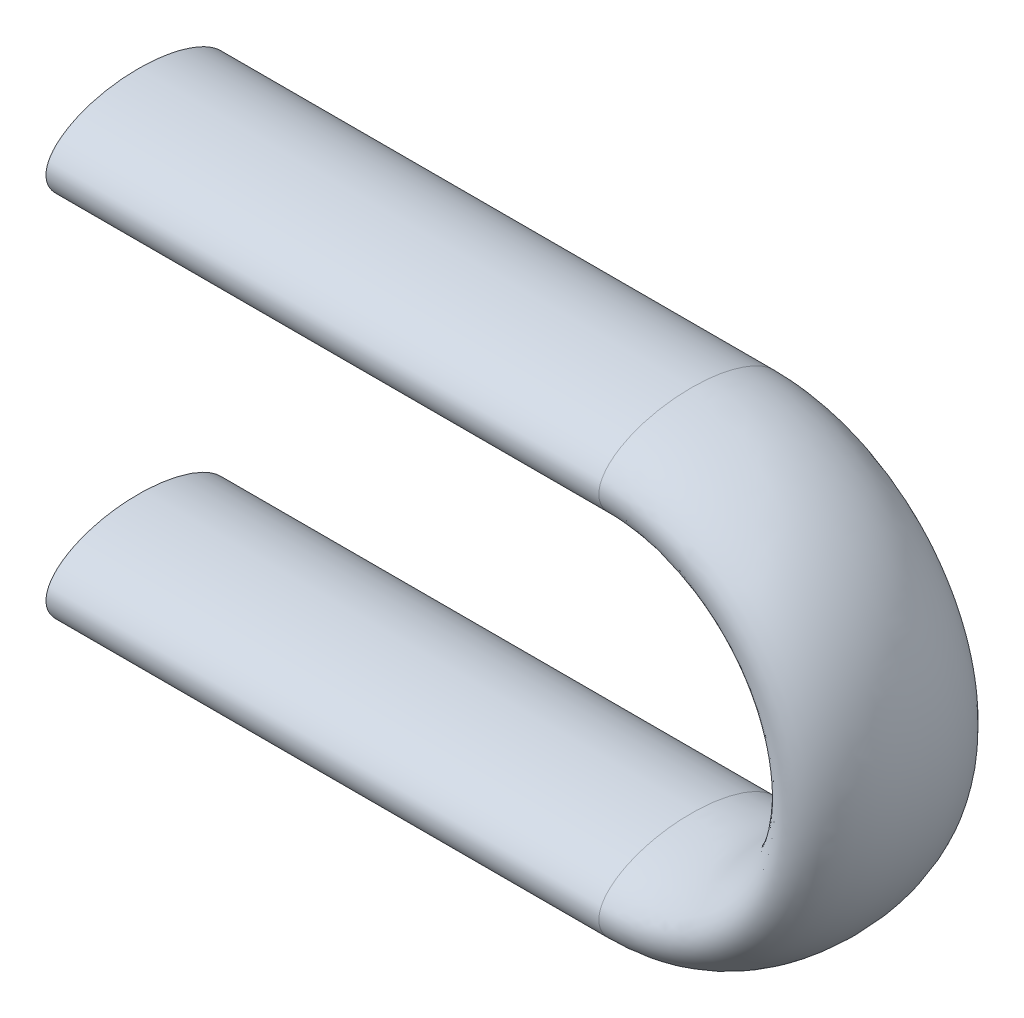
ISO-10303-21;
HEADER;
FILE_DESCRIPTION(('STEP AP214'),'2;1');
FILE_NAME('part.step','',(''),(''),'','','');
FILE_SCHEMA(('AUTOMOTIVE_DESIGN { 1 0 10303 214 1 1 1 1 }'));
ENDSEC;
DATA;
#1=APPLICATION_CONTEXT('core data for automotive mechanical design processes');
#2=APPLICATION_PROTOCOL_DEFINITION('international standard','automotive_design',2000,#1);
#3=PRODUCT_CONTEXT('',#1,'mechanical');
#4=PRODUCT('Part','Part','',(#3));
#5=PRODUCT_RELATED_PRODUCT_CATEGORY('part','',(#4));
#6=PRODUCT_DEFINITION_FORMATION('','',#4);
#7=PRODUCT_DEFINITION_CONTEXT('part definition',#1,'design');
#8=PRODUCT_DEFINITION('design','',#6,#7);
#9=PRODUCT_DEFINITION_SHAPE('','',#8);
#10=(LENGTH_UNIT() NAMED_UNIT(*) SI_UNIT(.MILLI.,.METRE.));
#11=(NAMED_UNIT(*) PLANE_ANGLE_UNIT() SI_UNIT($,.RADIAN.));
#12=(NAMED_UNIT(*) SI_UNIT($,.STERADIAN.) SOLID_ANGLE_UNIT());
#13=UNCERTAINTY_MEASURE_WITH_UNIT(LENGTH_MEASURE(1.E-05),#10,'distance_accuracy_value','');
#14=(GEOMETRIC_REPRESENTATION_CONTEXT(3) GLOBAL_UNCERTAINTY_ASSIGNED_CONTEXT((#13)) GLOBAL_UNIT_ASSIGNED_CONTEXT((#10,
#11,#12)) REPRESENTATION_CONTEXT('',''));
#15=CARTESIAN_POINT('',(0.,0.,0.));
#16=DIRECTION('',(0.,0.,1.));
#17=DIRECTION('',(1.,0.,0.));
#18=AXIS2_PLACEMENT_3D('',#15,#16,#17);
#19=CARTESIAN_POINT('',(0.,-203.2,0.));
#20=DIRECTION('',(-1.,0.,0.));
#21=DIRECTION('',(0.,0.,-1.));
#22=AXIS2_PLACEMENT_3D('',#19,#20,#21);
#23=PLANE('',#22);
#24=CARTESIAN_POINT('',(0.,-203.2,0.));
#25=DIRECTION('',(-1.,0.,0.));
#26=DIRECTION('',(0.,0.,1.));
#27=AXIS2_PLACEMENT_3D('',#24,#25,#26);
#28=CIRCLE('',#27,19.05);
#29=CARTESIAN_POINT('',(0.,-203.2,19.05));
#30=VERTEX_POINT('',#29);
#31=EDGE_CURVE('E51',#30,#30,#28,.F.);
#32=ORIENTED_EDGE('',*,*,#31,.T.);
#33=EDGE_LOOP('',(#32));
#34=FACE_BOUND('',#33,.T.);
#35=CARTESIAN_POINT('',(0.,-203.2,0.));
#36=DIRECTION('',(-1.,0.,0.));
#37=DIRECTION('',(0.,0.,1.));
#38=AXIS2_PLACEMENT_3D('',#35,#36,#37);
#39=ELLIPSE('',#38,50.8,25.4);
#40=CARTESIAN_POINT('',(0.,-203.2,50.8));
#41=VERTEX_POINT('',#40);
#42=EDGE_CURVE('E45',#41,#41,#39,.T.);
#43=ORIENTED_EDGE('',*,*,#42,.T.);
#44=EDGE_LOOP('',(#43));
#45=FACE_BOUND('',#44,.T.);
#46=ADVANCED_FACE('F31',(#34,#45),#23,.T.);
#47=CARTESIAN_POINT('',(0.,0.,0.));
#48=DIRECTION('',(1.,0.,0.));
#49=DIRECTION('',(0.,0.,-1.));
#50=AXIS2_PLACEMENT_3D('',#47,#48,#49);
#51=PLANE('',#50);
#52=CARTESIAN_POINT('',(0.,0.,0.));
#53=DIRECTION('',(1.,0.,0.));
#54=DIRECTION('',(0.,0.,-1.));
#55=AXIS2_PLACEMENT_3D('',#52,#53,#54);
#56=CIRCLE('',#55,19.05);
#57=CARTESIAN_POINT('',(0.,0.,-19.05));
#58=VERTEX_POINT('',#57);
#59=EDGE_CURVE('E50',#58,#58,#56,.F.);
#60=ORIENTED_EDGE('',*,*,#59,.F.);
#61=EDGE_LOOP('',(#60));
#62=FACE_BOUND('',#61,.T.);
#63=CARTESIAN_POINT('',(0.,0.,0.));
#64=DIRECTION('',(1.,0.,0.));
#65=DIRECTION('',(0.,0.,1.));
#66=AXIS2_PLACEMENT_3D('',#63,#64,#65);
#67=ELLIPSE('',#66,50.8,25.4);
#68=CARTESIAN_POINT('',(0.,0.,50.8));
#69=VERTEX_POINT('',#68);
#70=EDGE_CURVE('E10',#69,#69,#67,.T.);
#71=ORIENTED_EDGE('',*,*,#70,.F.);
#72=EDGE_LOOP('',(#71));
#73=FACE_BOUND('',#72,.T.);
#74=ADVANCED_FACE('F93',(#62,#73),#51,.F.);
#75=CARTESIAN_POINT('',(0.,-203.2,50.8));
#76=CARTESIAN_POINT('',(304.8,-203.2,50.8));
#77=CARTESIAN_POINT('',(0.,-152.4,50.8));
#78=CARTESIAN_POINT('',(304.8,-152.4,50.8));
#79=CARTESIAN_POINT('',(0.,-152.4,-50.8));
#80=CARTESIAN_POINT('',(304.8,-152.4,-50.8));
#81=CARTESIAN_POINT('',(0.,-203.2,-50.8));
#82=CARTESIAN_POINT('',(304.8,-203.2,-50.8));
#83=CARTESIAN_POINT('',(0.,-254.,-50.8));
#84=CARTESIAN_POINT('',(304.8,-254.,-50.8));
#85=CARTESIAN_POINT('',(0.,-254.,50.8));
#86=CARTESIAN_POINT('',(304.8,-254.,50.8));
#87=CARTESIAN_POINT('',(0.,-203.2,50.8));
#88=CARTESIAN_POINT('',(304.8,-203.2,50.8));
#89=(BOUNDED_SURFACE() B_SPLINE_SURFACE(3,1,((#75,#76),(#77,#78),(#79,#80),(#81,#82),(#83,#84),
(#85,#86),(#87,#88)),.UNSPECIFIED.,.T.,.F.,.F.) B_SPLINE_SURFACE_WITH_KNOTS((4,3,4),(2,2),(0.,
0.5,1.),(0.,1.),.UNSPECIFIED.) GEOMETRIC_REPRESENTATION_ITEM() RATIONAL_B_SPLINE_SURFACE(((1.,
1.),(0.333333333333333,0.333333333333333),(0.333333333333333,0.333333333333333),(1.,1.),
(0.333333333333333,0.333333333333333),(0.333333333333333,0.333333333333333),(1.,1.))) REPRESENTATION_ITEM('') SURFACE());
#90=CARTESIAN_POINT('',(304.8,-203.2,0.));
#91=DIRECTION('',(-1.,0.,0.));
#92=DIRECTION('',(0.,0.,1.));
#93=AXIS2_PLACEMENT_3D('',#90,#91,#92);
#94=ELLIPSE('',#93,50.8,25.4);
#95=CARTESIAN_POINT('',(304.8,-203.2,50.8));
#96=VERTEX_POINT('',#95);
#97=EDGE_CURVE('E41',#96,#96,#94,.T.);
#98=ORIENTED_EDGE('',*,*,#97,.T.);
#99=EDGE_LOOP('',(#98));
#100=FACE_BOUND('',#99,.T.);
#101=ORIENTED_EDGE('',*,*,#42,.F.);
#102=EDGE_LOOP('',(#101));
#103=FACE_BOUND('',#102,.T.);
#104=ADVANCED_FACE('F85',(#100,#103),#89,.F.);
#105=CARTESIAN_POINT('',(304.8,-203.2,50.8));
#106=CARTESIAN_POINT('',(508.,-203.2,50.8));
#107=CARTESIAN_POINT('',(508.,0.,50.8));
#108=CARTESIAN_POINT('',(304.8,0.,50.8));
#109=CARTESIAN_POINT('',(304.8,-152.4,50.8));
#110=CARTESIAN_POINT('',(406.4,-152.4,50.8));
#111=CARTESIAN_POINT('',(406.4,-50.8,50.8));
#112=CARTESIAN_POINT('',(304.8,-50.8,50.8));
#113=CARTESIAN_POINT('',(304.8,-152.4,-50.8));
#114=CARTESIAN_POINT('',(406.4,-152.4,-50.8));
#115=CARTESIAN_POINT('',(406.4,-50.8,-50.8));
#116=CARTESIAN_POINT('',(304.8,-50.8,-50.8));
#117=CARTESIAN_POINT('',(304.8,-203.2,-50.8));
#118=CARTESIAN_POINT('',(508.,-203.2,-50.8));
#119=CARTESIAN_POINT('',(508.,0.,-50.8));
#120=CARTESIAN_POINT('',(304.8,0.,-50.8));
#121=CARTESIAN_POINT('',(304.8,-254.,-50.8));
#122=CARTESIAN_POINT('',(609.6,-254.,-50.8));
#123=CARTESIAN_POINT('',(609.6,50.8,-50.8));
#124=CARTESIAN_POINT('',(304.8,50.8,-50.8));
#125=CARTESIAN_POINT('',(304.8,-254.,50.8));
#126=CARTESIAN_POINT('',(609.6,-254.,50.8));
#127=CARTESIAN_POINT('',(609.6,50.8,50.8));
#128=CARTESIAN_POINT('',(304.8,50.8,50.8));
#129=CARTESIAN_POINT('',(304.8,-203.2,50.8));
#130=CARTESIAN_POINT('',(508.,-203.2,50.8));
#131=CARTESIAN_POINT('',(508.,0.,50.8));
#132=CARTESIAN_POINT('',(304.8,0.,50.8));
#133=(BOUNDED_SURFACE() B_SPLINE_SURFACE(3,3,((#105,#106,#107,#108),(#109,#110,#111,#112),(#113,
#114,#115,#116),(#117,#118,#119,#120),(#121,#122,#123,#124),(#125,#126,#127,#128),(#129,#130,
#131,#132)),.UNSPECIFIED.,.T.,.F.,.F.) B_SPLINE_SURFACE_WITH_KNOTS((4,3,4),(4,4),(0.,0.5,1.),
(0.,1.),.UNSPECIFIED.) GEOMETRIC_REPRESENTATION_ITEM() RATIONAL_B_SPLINE_SURFACE(((1.,
0.333333333333333,0.333333333333333,1.),(0.333333333333333,0.111111111111111,0.111111111111111,
0.333333333333333),(0.333333333333333,0.111111111111111,0.111111111111111,0.333333333333333),
(1.,0.333333333333333,0.333333333333333,1.),(0.333333333333333,0.111111111111111,
0.111111111111111,0.333333333333333),(0.333333333333333,0.111111111111111,0.111111111111111,
0.333333333333333),(1.,0.333333333333333,0.333333333333333,1.))) REPRESENTATION_ITEM('') SURFACE());
#134=CARTESIAN_POINT('',(304.8,0.,0.));
#135=DIRECTION('',(1.,0.,0.));
#136=DIRECTION('',(0.,0.,1.));
#137=AXIS2_PLACEMENT_3D('',#134,#135,#136);
#138=ELLIPSE('',#137,50.8,25.4);
#139=CARTESIAN_POINT('',(304.8,0.,50.8));
#140=VERTEX_POINT('',#139);
#141=EDGE_CURVE('E37',#140,#140,#138,.T.);
#142=ORIENTED_EDGE('',*,*,#141,.T.);
#143=EDGE_LOOP('',(#142));
#144=FACE_BOUND('',#143,.T.);
#145=ORIENTED_EDGE('',*,*,#97,.F.);
#146=EDGE_LOOP('',(#145));
#147=FACE_BOUND('',#146,.T.);
#148=ADVANCED_FACE('F80',(#144,#147),#133,.F.);
#149=CARTESIAN_POINT('',(304.8,0.,50.8));
#150=CARTESIAN_POINT('',(0.,0.,50.8));
#151=CARTESIAN_POINT('',(304.8,-50.8,50.8));
#152=CARTESIAN_POINT('',(0.,-50.8,50.8));
#153=CARTESIAN_POINT('',(304.8,-50.8,-50.8));
#154=CARTESIAN_POINT('',(0.,-50.8,-50.8));
#155=CARTESIAN_POINT('',(304.8,0.,-50.8));
#156=CARTESIAN_POINT('',(0.,0.,-50.8));
#157=CARTESIAN_POINT('',(304.8,50.8,-50.8));
#158=CARTESIAN_POINT('',(0.,50.8,-50.8));
#159=CARTESIAN_POINT('',(304.8,50.8,50.8));
#160=CARTESIAN_POINT('',(0.,50.8,50.8));
#161=CARTESIAN_POINT('',(304.8,0.,50.8));
#162=CARTESIAN_POINT('',(0.,0.,50.8));
#163=(BOUNDED_SURFACE() B_SPLINE_SURFACE(3,1,((#149,#150),(#151,#152),(#153,#154),(#155,#156),
(#157,#158),(#159,#160),(#161,#162)),.UNSPECIFIED.,.T.,.F.,.F.) B_SPLINE_SURFACE_WITH_KNOTS((4,
3,4),(2,2),(0.,0.5,1.),(0.,1.),
.UNSPECIFIED.) GEOMETRIC_REPRESENTATION_ITEM() RATIONAL_B_SPLINE_SURFACE(((1.,1.),
(0.333333333333333,0.333333333333333),(0.333333333333333,0.333333333333333),(1.,1.),
(0.333333333333333,0.333333333333333),(0.333333333333333,0.333333333333333),(1.,1.))) REPRESENTATION_ITEM('') SURFACE());
#164=ORIENTED_EDGE('',*,*,#70,.T.);
#165=EDGE_LOOP('',(#164));
#166=FACE_BOUND('',#165,.T.);
#167=ORIENTED_EDGE('',*,*,#141,.F.);
#168=EDGE_LOOP('',(#167));
#169=FACE_BOUND('',#168,.T.);
#170=ADVANCED_FACE('F77',(#166,#169),#163,.F.);
#171=CARTESIAN_POINT('',(-3.04800000000003,-203.2,0.));
#172=DIRECTION('',(1.,0.,0.));
#173=DIRECTION('',(0.,0.,-1.));
#174=AXIS2_PLACEMENT_3D('',#171,#172,#173);
#175=CYLINDRICAL_SURFACE('',#174,19.05);
#176=CARTESIAN_POINT('',(304.8,-203.2,0.));
#177=DIRECTION('',(1.,0.,0.));
#178=DIRECTION('',(0.,0.,1.));
#179=AXIS2_PLACEMENT_3D('',#176,#177,#178);
#180=CIRCLE('',#179,19.05);
#181=CARTESIAN_POINT('',(304.8,-222.25,0.));
#182=VERTEX_POINT('',#181);
#183=EDGE_CURVE('E54',#182,#182,#180,.T.);
#184=ORIENTED_EDGE('',*,*,#183,.T.);
#185=EDGE_LOOP('',(#184));
#186=FACE_BOUND('',#185,.T.);
#187=ORIENTED_EDGE('',*,*,#31,.F.);
#188=EDGE_LOOP('',(#187));
#189=FACE_BOUND('',#188,.T.);
#190=ADVANCED_FACE('F63',(#186,#189),#175,.F.);
#191=CARTESIAN_POINT('',(304.8,-101.6,0.));
#192=DIRECTION('',(0.,0.,1.));
#193=DIRECTION('',(1.,0.,0.));
#194=AXIS2_PLACEMENT_3D('',#191,#192,#193);
#195=TOROIDAL_SURFACE('',#194,101.6,19.05);
#196=CARTESIAN_POINT('',(304.8,0.,0.));
#197=DIRECTION('',(-1.,0.,0.));
#198=DIRECTION('',(0.,0.,1.));
#199=AXIS2_PLACEMENT_3D('',#196,#197,#198);
#200=CIRCLE('',#199,19.05);
#201=CARTESIAN_POINT('',(304.8,19.05,0.));
#202=VERTEX_POINT('',#201);
#203=EDGE_CURVE('E57',#202,#202,#200,.T.);
#204=CARTESIAN_POINT('',(304.8,-101.6,0.));
#205=DIRECTION('',(0.,0.,1.));
#206=DIRECTION('',(1.,0.,0.));
#207=AXIS2_PLACEMENT_3D('',#204,#205,#206);
#208=CIRCLE('',#207,120.65);
#209=EDGE_CURVE('',#182,#202,#208,.T.);
#210=ORIENTED_EDGE('',*,*,#183,.F.);
#211=ORIENTED_EDGE('',*,*,#203,.T.);
#212=ORIENTED_EDGE('',*,*,#209,.T.);
#213=ORIENTED_EDGE('',*,*,#209,.F.);
#214=EDGE_LOOP('',(#210,#212,#211,#213));
#215=FACE_BOUND('',#214,.T.);
#216=ADVANCED_FACE('F66',(#215),#195,.F.);
#217=CARTESIAN_POINT('',(304.8,0.,0.));
#218=DIRECTION('',(-1.,0.,0.));
#219=DIRECTION('',(0.,0.,1.));
#220=AXIS2_PLACEMENT_3D('',#217,#218,#219);
#221=CYLINDRICAL_SURFACE('',#220,19.05);
#222=ORIENTED_EDGE('',*,*,#59,.T.);
#223=EDGE_LOOP('',(#222));
#224=FACE_BOUND('',#223,.T.);
#225=ORIENTED_EDGE('',*,*,#203,.F.);
#226=EDGE_LOOP('',(#225));
#227=FACE_BOUND('',#226,.T.);
#228=ADVANCED_FACE('F68',(#224,#227),#221,.F.);
#229=CLOSED_SHELL('',(#46,#74,#104,#148,#170,#190,#216,#228));
#230=MANIFOLD_SOLID_BREP('B2',#229);
#231=ADVANCED_BREP_SHAPE_REPRESENTATION('',(#18,#230),#14);
#232=SHAPE_DEFINITION_REPRESENTATION(#9,#231);
ENDSEC;
END-ISO-10303-21;
